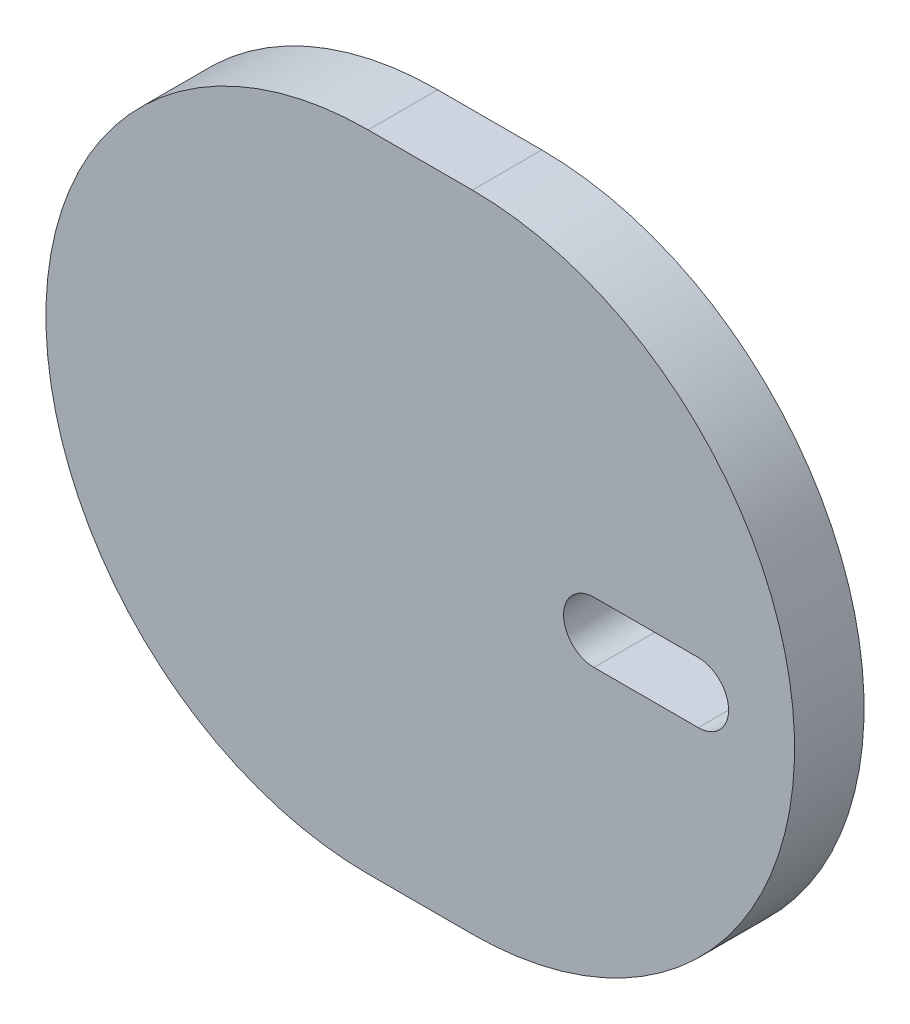
ISO-10303-21;
HEADER;
FILE_DESCRIPTION(('STEP AP214'),'2;1');
FILE_NAME('part.step','',(''),(''),'','','');
FILE_SCHEMA(('AUTOMOTIVE_DESIGN { 1 0 10303 214 1 1 1 1 }'));
ENDSEC;
DATA;
#1=APPLICATION_CONTEXT('core data for automotive mechanical design processes');
#2=APPLICATION_PROTOCOL_DEFINITION('international standard','automotive_design',2000,#1);
#3=PRODUCT_CONTEXT('',#1,'mechanical');
#4=PRODUCT('Part','Part','',(#3));
#5=PRODUCT_RELATED_PRODUCT_CATEGORY('part','',(#4));
#6=PRODUCT_DEFINITION_FORMATION('','',#4);
#7=PRODUCT_DEFINITION_CONTEXT('part definition',#1,'design');
#8=PRODUCT_DEFINITION('design','',#6,#7);
#9=PRODUCT_DEFINITION_SHAPE('','',#8);
#10=(LENGTH_UNIT() NAMED_UNIT(*) SI_UNIT(.MILLI.,.METRE.));
#11=(NAMED_UNIT(*) PLANE_ANGLE_UNIT() SI_UNIT($,.RADIAN.));
#12=(NAMED_UNIT(*) SI_UNIT($,.STERADIAN.) SOLID_ANGLE_UNIT());
#13=UNCERTAINTY_MEASURE_WITH_UNIT(LENGTH_MEASURE(1.E-05),#10,'distance_accuracy_value','');
#14=(GEOMETRIC_REPRESENTATION_CONTEXT(3) GLOBAL_UNCERTAINTY_ASSIGNED_CONTEXT((#13)) GLOBAL_UNIT_ASSIGNED_CONTEXT((#10,
#11,#12)) REPRESENTATION_CONTEXT('',''));
#15=CARTESIAN_POINT('',(0.,0.,0.));
#16=DIRECTION('',(0.,0.,1.));
#17=DIRECTION('',(1.,0.,0.));
#18=AXIS2_PLACEMENT_3D('',#15,#16,#17);
#19=CARTESIAN_POINT('',(98.,-160.,45.5));
#20=DIRECTION('',(0.,0.,1.));
#21=DIRECTION('',(1.,0.,0.));
#22=AXIS2_PLACEMENT_3D('',#19,#20,#21);
#23=PLANE('',#22);
#24=CARTESIAN_POINT('',(108.,-160.,45.5));
#25=DIRECTION('',(0.,0.,-1.));
#26=DIRECTION('',(0.,1.,0.));
#27=AXIS2_PLACEMENT_3D('',#24,#25,#26);
#28=CIRCLE('',#27,1.75);
#29=CARTESIAN_POINT('',(108.,-161.75,45.5));
#30=VERTEX_POINT('',#29);
#31=CARTESIAN_POINT('',(108.,-158.25,45.5));
#32=VERTEX_POINT('',#31);
#33=EDGE_CURVE('E110',#30,#32,#28,.T.);
#34=ORIENTED_EDGE('',*,*,#33,.F.);
#35=DIRECTION('',(-1.,0.,0.));
#36=VECTOR('',#35,1.);
#37=CARTESIAN_POINT('',(108.,-161.75,45.5));
#38=LINE('',#37,#36);
#39=CARTESIAN_POINT('',(114.,-161.75,45.5));
#40=VERTEX_POINT('',#39);
#41=EDGE_CURVE('E162',#40,#30,#38,.T.);
#42=ORIENTED_EDGE('',*,*,#41,.F.);
#43=CARTESIAN_POINT('',(114.,-160.,45.5));
#44=DIRECTION('',(0.,0.,-1.));
#45=DIRECTION('',(0.,-1.,0.));
#46=AXIS2_PLACEMENT_3D('',#43,#44,#45);
#47=CIRCLE('',#46,1.75);
#48=CARTESIAN_POINT('',(114.,-158.25,45.5));
#49=VERTEX_POINT('',#48);
#50=EDGE_CURVE('E154',#49,#40,#47,.T.);
#51=ORIENTED_EDGE('',*,*,#50,.F.);
#52=DIRECTION('',(1.,0.,0.));
#53=VECTOR('',#52,1.);
#54=CARTESIAN_POINT('',(114.,-158.25,45.5));
#55=LINE('',#54,#53);
#56=EDGE_CURVE('E124',#32,#49,#55,.T.);
#57=ORIENTED_EDGE('',*,*,#56,.F.);
#58=EDGE_LOOP('',(#34,#42,#51,#57));
#59=FACE_BOUND('',#58,.T.);
#60=CARTESIAN_POINT('',(95.,-160.,45.5));
#61=DIRECTION('',(0.,0.,1.));
#62=DIRECTION('',(0.,1.,0.));
#63=AXIS2_PLACEMENT_3D('',#60,#61,#62);
#64=CIRCLE('',#63,18.55);
#65=CARTESIAN_POINT('',(95.,-141.45,45.5));
#66=VERTEX_POINT('',#65);
#67=CARTESIAN_POINT('',(95.,-178.55,45.5));
#68=VERTEX_POINT('',#67);
#69=EDGE_CURVE('E27',#66,#68,#64,.T.);
#70=ORIENTED_EDGE('',*,*,#69,.F.);
#71=DIRECTION('',(-1.,0.,0.));
#72=VECTOR('',#71,1.);
#73=CARTESIAN_POINT('',(101.,-141.45,45.5));
#74=LINE('',#73,#72);
#75=CARTESIAN_POINT('',(101.,-141.45,45.5));
#76=VERTEX_POINT('',#75);
#77=EDGE_CURVE('E109',#76,#66,#74,.T.);
#78=ORIENTED_EDGE('',*,*,#77,.F.);
#79=CARTESIAN_POINT('',(101.,-160.,45.5));
#80=DIRECTION('',(0.,0.,1.));
#81=DIRECTION('',(0.,-1.,0.));
#82=AXIS2_PLACEMENT_3D('',#79,#80,#81);
#83=CIRCLE('',#82,18.55);
#84=CARTESIAN_POINT('',(101.,-178.55,45.5));
#85=VERTEX_POINT('',#84);
#86=EDGE_CURVE('E133',#85,#76,#83,.T.);
#87=ORIENTED_EDGE('',*,*,#86,.F.);
#88=DIRECTION('',(1.,0.,0.));
#89=VECTOR('',#88,1.);
#90=CARTESIAN_POINT('',(95.,-178.55,45.5));
#91=LINE('',#90,#89);
#92=EDGE_CURVE('E150',#68,#85,#91,.T.);
#93=ORIENTED_EDGE('',*,*,#92,.F.);
#94=EDGE_LOOP('',(#70,#78,#87,#93));
#95=FACE_BOUND('',#94,.T.);
#96=ADVANCED_FACE('F17',(#59,#95),#23,.F.);
#97=CARTESIAN_POINT('',(98.,-160.,49.5));
#98=DIRECTION('',(0.,0.,1.));
#99=DIRECTION('',(1.,0.,0.));
#100=AXIS2_PLACEMENT_3D('',#97,#98,#99);
#101=PLANE('',#100);
#102=CARTESIAN_POINT('',(108.,-160.,49.5));
#103=DIRECTION('',(0.,0.,-1.));
#104=DIRECTION('',(0.,1.,0.));
#105=AXIS2_PLACEMENT_3D('',#102,#103,#104);
#106=CIRCLE('',#105,1.75);
#107=CARTESIAN_POINT('',(108.,-161.75,49.5));
#108=VERTEX_POINT('',#107);
#109=CARTESIAN_POINT('',(108.,-158.25,49.5));
#110=VERTEX_POINT('',#109);
#111=EDGE_CURVE('E97',#108,#110,#106,.T.);
#112=ORIENTED_EDGE('',*,*,#111,.T.);
#113=DIRECTION('',(1.,0.,0.));
#114=VECTOR('',#113,1.);
#115=CARTESIAN_POINT('',(114.,-158.25,49.5));
#116=LINE('',#115,#114);
#117=CARTESIAN_POINT('',(114.,-158.25,49.5));
#118=VERTEX_POINT('',#117);
#119=EDGE_CURVE('E101',#110,#118,#116,.T.);
#120=ORIENTED_EDGE('',*,*,#119,.T.);
#121=CARTESIAN_POINT('',(114.,-160.,49.5));
#122=DIRECTION('',(0.,0.,-1.));
#123=DIRECTION('',(0.,-1.,0.));
#124=AXIS2_PLACEMENT_3D('',#121,#122,#123);
#125=CIRCLE('',#124,1.75);
#126=CARTESIAN_POINT('',(114.,-161.75,49.5));
#127=VERTEX_POINT('',#126);
#128=EDGE_CURVE('E157',#118,#127,#125,.T.);
#129=ORIENTED_EDGE('',*,*,#128,.T.);
#130=DIRECTION('',(-1.,0.,0.));
#131=VECTOR('',#130,1.);
#132=CARTESIAN_POINT('',(108.,-161.75,49.5));
#133=LINE('',#132,#131);
#134=EDGE_CURVE('E104',#127,#108,#133,.T.);
#135=ORIENTED_EDGE('',*,*,#134,.T.);
#136=EDGE_LOOP('',(#112,#120,#129,#135));
#137=FACE_BOUND('',#136,.T.);
#138=CARTESIAN_POINT('',(95.,-160.,49.5));
#139=DIRECTION('',(0.,0.,1.));
#140=DIRECTION('',(0.,1.,0.));
#141=AXIS2_PLACEMENT_3D('',#138,#139,#140);
#142=CIRCLE('',#141,18.55);
#143=CARTESIAN_POINT('',(95.,-141.45,49.5));
#144=VERTEX_POINT('',#143);
#145=CARTESIAN_POINT('',(95.,-178.55,49.5));
#146=VERTEX_POINT('',#145);
#147=EDGE_CURVE('E11',#144,#146,#142,.T.);
#148=ORIENTED_EDGE('',*,*,#147,.T.);
#149=DIRECTION('',(1.,0.,0.));
#150=VECTOR('',#149,1.);
#151=CARTESIAN_POINT('',(95.,-178.55,49.5));
#152=LINE('',#151,#150);
#153=CARTESIAN_POINT('',(101.,-178.55,49.5));
#154=VERTEX_POINT('',#153);
#155=EDGE_CURVE('E20',#146,#154,#152,.T.);
#156=ORIENTED_EDGE('',*,*,#155,.T.);
#157=CARTESIAN_POINT('',(101.,-160.,49.5));
#158=DIRECTION('',(0.,0.,1.));
#159=DIRECTION('',(0.,-1.,0.));
#160=AXIS2_PLACEMENT_3D('',#157,#158,#159);
#161=CIRCLE('',#160,18.55);
#162=CARTESIAN_POINT('',(101.,-141.45,49.5));
#163=VERTEX_POINT('',#162);
#164=EDGE_CURVE('E151',#154,#163,#161,.T.);
#165=ORIENTED_EDGE('',*,*,#164,.T.);
#166=DIRECTION('',(-1.,0.,0.));
#167=VECTOR('',#166,1.);
#168=CARTESIAN_POINT('',(101.,-141.45,49.5));
#169=LINE('',#168,#167);
#170=EDGE_CURVE('E139',#163,#144,#169,.T.);
#171=ORIENTED_EDGE('',*,*,#170,.T.);
#172=EDGE_LOOP('',(#148,#156,#165,#171));
#173=FACE_BOUND('',#172,.T.);
#174=ADVANCED_FACE('F99',(#137,#173),#101,.T.);
#175=CARTESIAN_POINT('',(95.,-160.,45.5));
#176=DIRECTION('',(0.,0.,1.));
#177=DIRECTION('',(0.,1.,0.));
#178=AXIS2_PLACEMENT_3D('',#175,#176,#177);
#179=CYLINDRICAL_SURFACE('',#178,18.55);
#180=ORIENTED_EDGE('',*,*,#69,.T.);
#181=DIRECTION('',(0.,0.,1.));
#182=VECTOR('',#181,1.);
#183=CARTESIAN_POINT('',(95.,-178.55,45.5));
#184=LINE('',#183,#182);
#185=EDGE_CURVE('E180',#68,#146,#184,.T.);
#186=ORIENTED_EDGE('',*,*,#185,.T.);
#187=ORIENTED_EDGE('',*,*,#147,.F.);
#188=DIRECTION('',(0.,0.,1.));
#189=VECTOR('',#188,1.);
#190=CARTESIAN_POINT('',(95.,-141.45,45.5));
#191=LINE('',#190,#189);
#192=EDGE_CURVE('E135',#66,#144,#191,.T.);
#193=ORIENTED_EDGE('',*,*,#192,.F.);
#194=EDGE_LOOP('',(#180,#186,#187,#193));
#195=FACE_BOUND('',#194,.T.);
#196=ADVANCED_FACE('F209',(#195),#179,.T.);
#197=CARTESIAN_POINT('',(95.,-178.55,45.5));
#198=DIRECTION('',(0.,-1.,0.));
#199=DIRECTION('',(0.,0.,-1.));
#200=AXIS2_PLACEMENT_3D('',#197,#198,#199);
#201=PLANE('',#200);
#202=ORIENTED_EDGE('',*,*,#92,.T.);
#203=DIRECTION('',(0.,0.,1.));
#204=VECTOR('',#203,1.);
#205=CARTESIAN_POINT('',(101.,-178.55,45.5));
#206=LINE('',#205,#204);
#207=EDGE_CURVE('E146',#85,#154,#206,.T.);
#208=ORIENTED_EDGE('',*,*,#207,.T.);
#209=ORIENTED_EDGE('',*,*,#155,.F.);
#210=ORIENTED_EDGE('',*,*,#185,.F.);
#211=EDGE_LOOP('',(#202,#208,#209,#210));
#212=FACE_BOUND('',#211,.T.);
#213=ADVANCED_FACE('F215',(#212),#201,.T.);
#214=CARTESIAN_POINT('',(101.,-160.,45.5));
#215=DIRECTION('',(0.,0.,1.));
#216=DIRECTION('',(0.,-1.,0.));
#217=AXIS2_PLACEMENT_3D('',#214,#215,#216);
#218=CYLINDRICAL_SURFACE('',#217,18.55);
#219=ORIENTED_EDGE('',*,*,#86,.T.);
#220=DIRECTION('',(0.,0.,1.));
#221=VECTOR('',#220,1.);
#222=CARTESIAN_POINT('',(101.,-141.45,45.5));
#223=LINE('',#222,#221);
#224=EDGE_CURVE('E142',#76,#163,#223,.T.);
#225=ORIENTED_EDGE('',*,*,#224,.T.);
#226=ORIENTED_EDGE('',*,*,#164,.F.);
#227=ORIENTED_EDGE('',*,*,#207,.F.);
#228=EDGE_LOOP('',(#219,#225,#226,#227));
#229=FACE_BOUND('',#228,.T.);
#230=ADVANCED_FACE('F324',(#229),#218,.T.);
#231=CARTESIAN_POINT('',(101.,-141.45,45.5));
#232=DIRECTION('',(0.,1.,0.));
#233=DIRECTION('',(1.,0.,0.));
#234=AXIS2_PLACEMENT_3D('',#231,#232,#233);
#235=PLANE('',#234);
#236=ORIENTED_EDGE('',*,*,#77,.T.);
#237=ORIENTED_EDGE('',*,*,#192,.T.);
#238=ORIENTED_EDGE('',*,*,#170,.F.);
#239=ORIENTED_EDGE('',*,*,#224,.F.);
#240=EDGE_LOOP('',(#236,#237,#238,#239));
#241=FACE_BOUND('',#240,.T.);
#242=ADVANCED_FACE('F206',(#241),#235,.T.);
#243=CARTESIAN_POINT('',(108.,-160.,45.5));
#244=DIRECTION('',(0.,0.,1.));
#245=DIRECTION('',(0.,1.,0.));
#246=AXIS2_PLACEMENT_3D('',#243,#244,#245);
#247=CYLINDRICAL_SURFACE('',#246,1.75);
#248=ORIENTED_EDGE('',*,*,#33,.T.);
#249=DIRECTION('',(0.,0.,1.));
#250=VECTOR('',#249,1.);
#251=CARTESIAN_POINT('',(108.,-158.25,45.5));
#252=LINE('',#251,#250);
#253=EDGE_CURVE('E113',#32,#110,#252,.T.);
#254=ORIENTED_EDGE('',*,*,#253,.T.);
#255=ORIENTED_EDGE('',*,*,#111,.F.);
#256=DIRECTION('',(0.,0.,1.));
#257=VECTOR('',#256,1.);
#258=CARTESIAN_POINT('',(108.,-161.75,45.5));
#259=LINE('',#258,#257);
#260=EDGE_CURVE('E159',#30,#108,#259,.T.);
#261=ORIENTED_EDGE('',*,*,#260,.F.);
#262=EDGE_LOOP('',(#248,#254,#255,#261));
#263=FACE_BOUND('',#262,.T.);
#264=ADVANCED_FACE('F114',(#263),#247,.F.);
#265=CARTESIAN_POINT('',(108.,-158.25,45.5));
#266=DIRECTION('',(0.,-1.,0.));
#267=DIRECTION('',(0.,0.,-1.));
#268=AXIS2_PLACEMENT_3D('',#265,#266,#267);
#269=PLANE('',#268);
#270=ORIENTED_EDGE('',*,*,#56,.T.);
#271=DIRECTION('',(0.,0.,1.));
#272=VECTOR('',#271,1.);
#273=CARTESIAN_POINT('',(114.,-158.25,45.5));
#274=LINE('',#273,#272);
#275=EDGE_CURVE('E121',#49,#118,#274,.T.);
#276=ORIENTED_EDGE('',*,*,#275,.T.);
#277=ORIENTED_EDGE('',*,*,#119,.F.);
#278=ORIENTED_EDGE('',*,*,#253,.F.);
#279=EDGE_LOOP('',(#270,#276,#277,#278));
#280=FACE_BOUND('',#279,.T.);
#281=ADVANCED_FACE('F119',(#280),#269,.T.);
#282=CARTESIAN_POINT('',(114.,-160.,45.5));
#283=DIRECTION('',(0.,0.,1.));
#284=DIRECTION('',(0.,-1.,0.));
#285=AXIS2_PLACEMENT_3D('',#282,#283,#284);
#286=CYLINDRICAL_SURFACE('',#285,1.75);
#287=ORIENTED_EDGE('',*,*,#50,.T.);
#288=DIRECTION('',(0.,0.,1.));
#289=VECTOR('',#288,1.);
#290=CARTESIAN_POINT('',(114.,-161.75,45.5));
#291=LINE('',#290,#289);
#292=EDGE_CURVE('E158',#40,#127,#291,.T.);
#293=ORIENTED_EDGE('',*,*,#292,.T.);
#294=ORIENTED_EDGE('',*,*,#128,.F.);
#295=ORIENTED_EDGE('',*,*,#275,.F.);
#296=EDGE_LOOP('',(#287,#293,#294,#295));
#297=FACE_BOUND('',#296,.T.);
#298=ADVANCED_FACE('F184',(#297),#286,.F.);
#299=CARTESIAN_POINT('',(114.,-161.75,45.5));
#300=DIRECTION('',(0.,1.,0.));
#301=DIRECTION('',(1.,0.,0.));
#302=AXIS2_PLACEMENT_3D('',#299,#300,#301);
#303=PLANE('',#302);
#304=ORIENTED_EDGE('',*,*,#41,.T.);
#305=ORIENTED_EDGE('',*,*,#260,.T.);
#306=ORIENTED_EDGE('',*,*,#134,.F.);
#307=ORIENTED_EDGE('',*,*,#292,.F.);
#308=EDGE_LOOP('',(#304,#305,#306,#307));
#309=FACE_BOUND('',#308,.T.);
#310=ADVANCED_FACE('F272',(#309),#303,.T.);
#311=CLOSED_SHELL('',(#96,#174,#196,#213,#230,#242,#264,#281,#298,#310));
#312=MANIFOLD_SOLID_BREP('B1',#311);
#313=ADVANCED_BREP_SHAPE_REPRESENTATION('',(#18,#312),#14);
#314=SHAPE_DEFINITION_REPRESENTATION(#9,#313);
ENDSEC;
END-ISO-10303-21;
